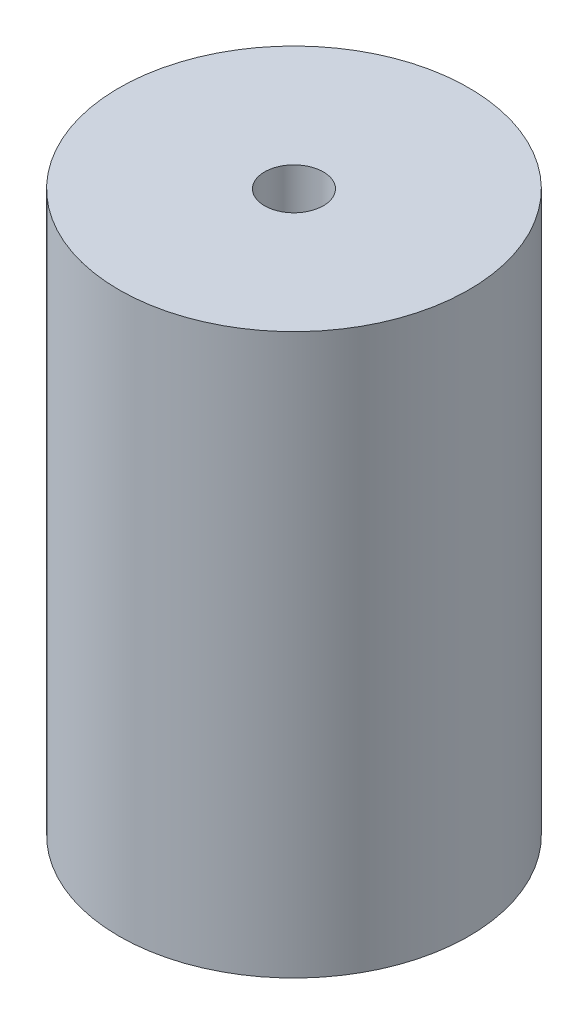
ISO-10303-21;
HEADER;
FILE_DESCRIPTION(('STEP AP214'),'2;1');
FILE_NAME('part.step','',(''),(''),'','','');
FILE_SCHEMA(('AUTOMOTIVE_DESIGN { 1 0 10303 214 1 1 1 1 }'));
ENDSEC;
DATA;
#1=APPLICATION_CONTEXT('core data for automotive mechanical design processes');
#2=APPLICATION_PROTOCOL_DEFINITION('international standard','automotive_design',2000,#1);
#3=PRODUCT_CONTEXT('',#1,'mechanical');
#4=PRODUCT('Part','Part','',(#3));
#5=PRODUCT_RELATED_PRODUCT_CATEGORY('part','',(#4));
#6=PRODUCT_DEFINITION_FORMATION('','',#4);
#7=PRODUCT_DEFINITION_CONTEXT('part definition',#1,'design');
#8=PRODUCT_DEFINITION('design','',#6,#7);
#9=PRODUCT_DEFINITION_SHAPE('','',#8);
#10=(LENGTH_UNIT() NAMED_UNIT(*) SI_UNIT(.MILLI.,.METRE.));
#11=(NAMED_UNIT(*) PLANE_ANGLE_UNIT() SI_UNIT($,.RADIAN.));
#12=(NAMED_UNIT(*) SI_UNIT($,.STERADIAN.) SOLID_ANGLE_UNIT());
#13=UNCERTAINTY_MEASURE_WITH_UNIT(LENGTH_MEASURE(1.E-05),#10,'distance_accuracy_value','');
#14=(GEOMETRIC_REPRESENTATION_CONTEXT(3) GLOBAL_UNCERTAINTY_ASSIGNED_CONTEXT((#13)) GLOBAL_UNIT_ASSIGNED_CONTEXT((#10,
#11,#12)) REPRESENTATION_CONTEXT('',''));
#15=CARTESIAN_POINT('',(0.,0.,0.));
#16=DIRECTION('',(0.,0.,1.));
#17=DIRECTION('',(1.,0.,0.));
#18=AXIS2_PLACEMENT_3D('',#15,#16,#17);
#19=CARTESIAN_POINT('',(0.,40.,0.));
#20=DIRECTION('',(0.,-1.,0.));
#21=DIRECTION('',(0.,0.,-1.));
#22=AXIS2_PLACEMENT_3D('',#19,#20,#21);
#23=CYLINDRICAL_SURFACE('',#22,12.5);
#24=CARTESIAN_POINT('',(0.,40.,0.));
#25=DIRECTION('',(0.,1.,0.));
#26=DIRECTION('',(0.,0.,1.));
#27=AXIS2_PLACEMENT_3D('',#24,#25,#26);
#28=CIRCLE('',#27,12.5);
#29=CARTESIAN_POINT('',(0.,40.,12.5));
#30=VERTEX_POINT('',#29);
#31=EDGE_CURVE('E10',#30,#30,#28,.T.);
#32=ORIENTED_EDGE('',*,*,#31,.F.);
#33=EDGE_LOOP('',(#32));
#34=FACE_BOUND('',#33,.T.);
#35=CARTESIAN_POINT('',(0.,0.,0.));
#36=DIRECTION('',(0.,1.,0.));
#37=DIRECTION('',(0.,0.,1.));
#38=AXIS2_PLACEMENT_3D('',#35,#36,#37);
#39=CIRCLE('',#38,12.5);
#40=CARTESIAN_POINT('',(0.,0.,12.5));
#41=VERTEX_POINT('',#40);
#42=EDGE_CURVE('E40',#41,#41,#39,.T.);
#43=ORIENTED_EDGE('',*,*,#42,.T.);
#44=EDGE_LOOP('',(#43));
#45=FACE_BOUND('',#44,.T.);
#46=ADVANCED_FACE('F37',(#34,#45),#23,.T.);
#47=CARTESIAN_POINT('',(0.,40.,0.));
#48=DIRECTION('',(0.,1.,0.));
#49=DIRECTION('',(0.,0.,1.));
#50=AXIS2_PLACEMENT_3D('',#47,#48,#49);
#51=PLANE('',#50);
#52=CARTESIAN_POINT('',(0.,40.,0.));
#53=DIRECTION('',(0.,1.,0.));
#54=DIRECTION('',(0.,0.,1.));
#55=AXIS2_PLACEMENT_3D('',#52,#53,#54);
#56=CIRCLE('',#55,2.1);
#57=CARTESIAN_POINT('',(0.,40.,2.1));
#58=VERTEX_POINT('',#57);
#59=EDGE_CURVE('E51',#58,#58,#56,.T.);
#60=ORIENTED_EDGE('',*,*,#59,.F.);
#61=EDGE_LOOP('',(#60));
#62=FACE_BOUND('',#61,.T.);
#63=ORIENTED_EDGE('',*,*,#31,.T.);
#64=EDGE_LOOP('',(#63));
#65=FACE_BOUND('',#64,.T.);
#66=ADVANCED_FACE('F68',(#62,#65),#51,.T.);
#67=CARTESIAN_POINT('',(0.,0.,0.));
#68=DIRECTION('',(0.,1.,0.));
#69=DIRECTION('',(0.,0.,1.));
#70=AXIS2_PLACEMENT_3D('',#67,#68,#69);
#71=PLANE('',#70);
#72=ORIENTED_EDGE('',*,*,#42,.F.);
#73=EDGE_LOOP('',(#72));
#74=FACE_BOUND('',#73,.T.);
#75=ADVANCED_FACE('F64',(#74),#71,.F.);
#76=CARTESIAN_POINT('',(0.,19.,0.));
#77=DIRECTION('',(0.,1.,0.));
#78=DIRECTION('',(0.,0.,1.));
#79=AXIS2_PLACEMENT_3D('',#76,#77,#78);
#80=CYLINDRICAL_SURFACE('',#79,2.1);
#81=CARTESIAN_POINT('',(0.,19.,0.));
#82=DIRECTION('',(0.,1.,0.));
#83=DIRECTION('',(0.,0.,1.));
#84=AXIS2_PLACEMENT_3D('',#81,#82,#83);
#85=CIRCLE('',#84,2.1);
#86=CARTESIAN_POINT('',(0.,19.,2.1));
#87=VERTEX_POINT('',#86);
#88=EDGE_CURVE('E49',#87,#87,#85,.T.);
#89=CARTESIAN_POINT('',(0.,19.,2.1));
#90=CARTESIAN_POINT('',(0.,19.21875,2.1));
#91=CARTESIAN_POINT('',(0.,19.4375,2.1));
#92=CARTESIAN_POINT('',(0.,19.875,2.1));
#93=CARTESIAN_POINT('',(0.,20.09375,2.1));
#94=CARTESIAN_POINT('',(0.,20.53125,2.1));
#95=CARTESIAN_POINT('',(0.,20.75,2.1));
#96=CARTESIAN_POINT('',(0.,21.1875,2.1));
#97=CARTESIAN_POINT('',(0.,21.40625,2.1));
#98=CARTESIAN_POINT('',(0.,21.84375,2.1));
#99=CARTESIAN_POINT('',(0.,22.0625,2.1));
#100=CARTESIAN_POINT('',(0.,22.5,2.1));
#101=CARTESIAN_POINT('',(0.,22.71875,2.1));
#102=CARTESIAN_POINT('',(0.,23.15625,2.1));
#103=CARTESIAN_POINT('',(0.,23.375,2.1));
#104=CARTESIAN_POINT('',(0.,23.8125,2.1));
#105=CARTESIAN_POINT('',(0.,24.03125,2.1));
#106=CARTESIAN_POINT('',(0.,24.46875,2.1));
#107=CARTESIAN_POINT('',(0.,24.6875,2.1));
#108=CARTESIAN_POINT('',(0.,25.125,2.1));
#109=CARTESIAN_POINT('',(0.,25.34375,2.1));
#110=CARTESIAN_POINT('',(0.,25.78125,2.1));
#111=CARTESIAN_POINT('',(0.,26.,2.1));
#112=CARTESIAN_POINT('',(0.,26.4375,2.1));
#113=CARTESIAN_POINT('',(0.,26.65625,2.1));
#114=CARTESIAN_POINT('',(0.,27.09375,2.1));
#115=CARTESIAN_POINT('',(0.,27.3125,2.1));
#116=CARTESIAN_POINT('',(0.,27.75,2.1));
#117=CARTESIAN_POINT('',(0.,27.96875,2.1));
#118=CARTESIAN_POINT('',(0.,28.40625,2.1));
#119=CARTESIAN_POINT('',(0.,28.625,2.1));
#120=CARTESIAN_POINT('',(0.,29.0625,2.1));
#121=CARTESIAN_POINT('',(0.,29.28125,2.1));
#122=CARTESIAN_POINT('',(0.,29.71875,2.1));
#123=CARTESIAN_POINT('',(0.,29.9375,2.1));
#124=CARTESIAN_POINT('',(0.,30.375,2.1));
#125=CARTESIAN_POINT('',(0.,30.59375,2.1));
#126=CARTESIAN_POINT('',(0.,31.03125,2.1));
#127=CARTESIAN_POINT('',(0.,31.25,2.1));
#128=CARTESIAN_POINT('',(0.,31.6875,2.1));
#129=CARTESIAN_POINT('',(0.,31.90625,2.1));
#130=CARTESIAN_POINT('',(0.,32.34375,2.1));
#131=CARTESIAN_POINT('',(0.,32.5625,2.1));
#132=CARTESIAN_POINT('',(0.,33.,2.1));
#133=CARTESIAN_POINT('',(0.,33.21875,2.1));
#134=CARTESIAN_POINT('',(0.,33.65625,2.1));
#135=CARTESIAN_POINT('',(0.,33.875,2.1));
#136=CARTESIAN_POINT('',(0.,34.3125,2.1));
#137=CARTESIAN_POINT('',(0.,34.53125,2.1));
#138=CARTESIAN_POINT('',(0.,34.96875,2.1));
#139=CARTESIAN_POINT('',(0.,35.1875,2.1));
#140=CARTESIAN_POINT('',(0.,35.625,2.1));
#141=CARTESIAN_POINT('',(0.,35.84375,2.1));
#142=CARTESIAN_POINT('',(0.,36.28125,2.1));
#143=CARTESIAN_POINT('',(0.,36.5,2.1));
#144=CARTESIAN_POINT('',(0.,36.9375,2.1));
#145=CARTESIAN_POINT('',(0.,37.15625,2.1));
#146=CARTESIAN_POINT('',(0.,37.59375,2.1));
#147=CARTESIAN_POINT('',(0.,37.8125,2.1));
#148=CARTESIAN_POINT('',(0.,38.25,2.1));
#149=CARTESIAN_POINT('',(0.,38.46875,2.1));
#150=CARTESIAN_POINT('',(0.,38.90625,2.1));
#151=CARTESIAN_POINT('',(0.,39.125,2.1));
#152=CARTESIAN_POINT('',(0.,39.5625,2.1));
#153=CARTESIAN_POINT('',(0.,39.78125,2.1));
#154=CARTESIAN_POINT('',(0.,40.,2.1));
#155=B_SPLINE_CURVE_WITH_KNOTS('',3,(#89,#90,#91,#92,#93,#94,#95,#96,#97,#98,#99,#100,#101,#102,
#103,#104,#105,#106,#107,#108,#109,#110,#111,#112,#113,#114,#115,#116,#117,#118,#119,#120,#121,
#122,#123,#124,#125,#126,#127,#128,#129,#130,#131,#132,#133,#134,#135,#136,#137,#138,#139,#140,
#141,#142,#143,#144,#145,#146,#147,#148,#149,#150,#151,#152,#153,#154),.UNSPECIFIED.,.F.,.F.,(4,
2,2,2,2,2,2,2,2,2,2,2,2,2,2,2,2,2,2,2,2,2,2,2,2,2,2,2,2,2,2,2,4),(0.,0.656249999999997,1.3125,
1.96875,2.625,3.28125,3.9375,4.59375,5.25,5.90625,6.5625,7.21875,7.875,8.53125,9.1875,9.84375,
10.5,11.15625,11.8125,12.46875,13.125,13.78125,14.4375,15.09375,15.75,16.40625,17.0625,17.71875,
18.375,19.03125,19.6875,20.34375,21.),.UNSPECIFIED.);
#156=EDGE_CURVE('BSEAM61',#87,#58,#155,.T.);
#157=ORIENTED_EDGE('',*,*,#88,.F.);
#158=ORIENTED_EDGE('',*,*,#59,.T.);
#159=ORIENTED_EDGE('',*,*,#156,.T.);
#160=ORIENTED_EDGE('',*,*,#156,.F.);
#161=EDGE_LOOP('',(#157,#159,#158,#160));
#162=FACE_BOUND('',#161,.T.);
#163=ADVANCED_FACE('F61',(#162),#80,.F.);
#164=CARTESIAN_POINT('',(0.,19.,0.));
#165=DIRECTION('',(0.,1.,0.));
#166=DIRECTION('',(0.,0.,1.));
#167=AXIS2_PLACEMENT_3D('',#164,#165,#166);
#168=PLANE('',#167);
#169=ORIENTED_EDGE('',*,*,#88,.T.);
#170=EDGE_LOOP('',(#169));
#171=FACE_BOUND('',#170,.T.);
#172=ADVANCED_FACE('F59',(#171),#168,.T.);
#173=CLOSED_SHELL('',(#46,#66,#75,#163,#172));
#174=MANIFOLD_SOLID_BREP('B2',#173);
#175=ADVANCED_BREP_SHAPE_REPRESENTATION('',(#18,#174),#14);
#176=SHAPE_DEFINITION_REPRESENTATION(#9,#175);
ENDSEC;
END-ISO-10303-21;
